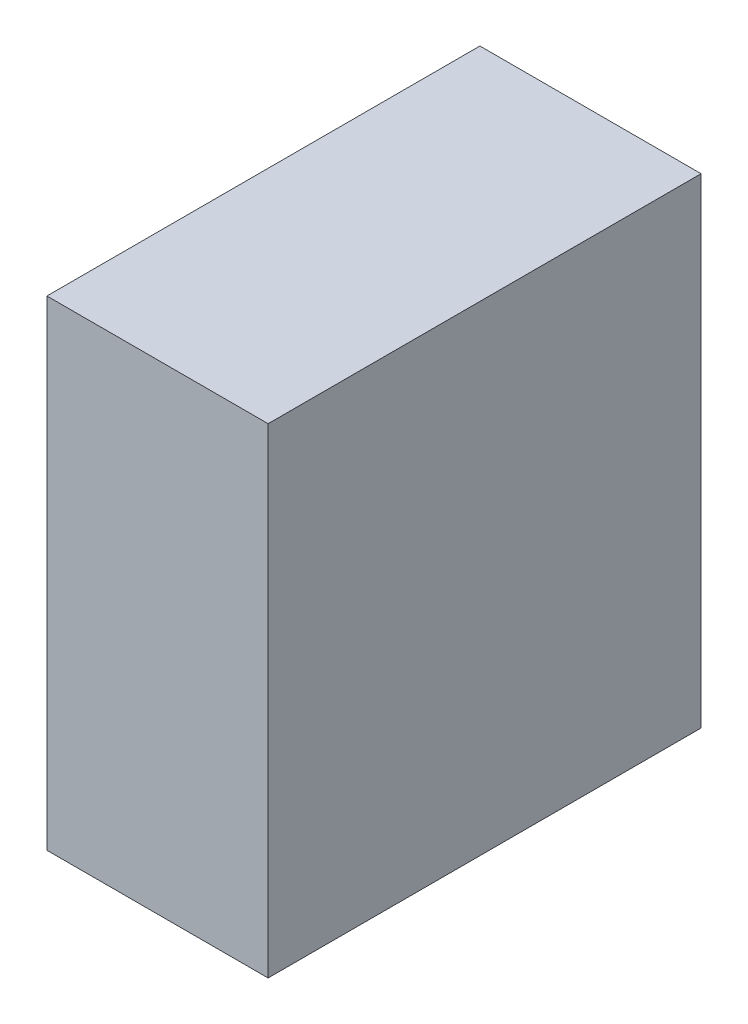
ISO-10303-21;
HEADER;
FILE_DESCRIPTION(('STEP AP214'),'2;1');
FILE_NAME('part.step','',(''),(''),'','','');
FILE_SCHEMA(('AUTOMOTIVE_DESIGN { 1 0 10303 214 1 1 1 1 }'));
ENDSEC;
DATA;
#1=APPLICATION_CONTEXT('core data for automotive mechanical design processes');
#2=APPLICATION_PROTOCOL_DEFINITION('international standard','automotive_design',2000,#1);
#3=PRODUCT_CONTEXT('',#1,'mechanical');
#4=PRODUCT('Part','Part','',(#3));
#5=PRODUCT_RELATED_PRODUCT_CATEGORY('part','',(#4));
#6=PRODUCT_DEFINITION_FORMATION('','',#4);
#7=PRODUCT_DEFINITION_CONTEXT('part definition',#1,'design');
#8=PRODUCT_DEFINITION('design','',#6,#7);
#9=PRODUCT_DEFINITION_SHAPE('','',#8);
#10=(LENGTH_UNIT() NAMED_UNIT(*) SI_UNIT(.MILLI.,.METRE.));
#11=(NAMED_UNIT(*) PLANE_ANGLE_UNIT() SI_UNIT($,.RADIAN.));
#12=(NAMED_UNIT(*) SI_UNIT($,.STERADIAN.) SOLID_ANGLE_UNIT());
#13=UNCERTAINTY_MEASURE_WITH_UNIT(LENGTH_MEASURE(1.E-05),#10,'distance_accuracy_value','');
#14=(GEOMETRIC_REPRESENTATION_CONTEXT(3) GLOBAL_UNCERTAINTY_ASSIGNED_CONTEXT((#13)) GLOBAL_UNIT_ASSIGNED_CONTEXT((#10,
#11,#12)) REPRESENTATION_CONTEXT('',''));
#15=CARTESIAN_POINT('',(0.,0.,0.));
#16=DIRECTION('',(0.,0.,1.));
#17=DIRECTION('',(1.,0.,0.));
#18=AXIS2_PLACEMENT_3D('',#15,#16,#17);
#19=CARTESIAN_POINT('',(2.35000038,-5.09999996,0.));
#20=DIRECTION('',(-1.,0.,0.));
#21=DIRECTION('',(0.,1.,0.));
#22=AXIS2_PLACEMENT_3D('',#19,#20,#21);
#23=PLANE('',#22);
#24=DIRECTION('',(0.,1.,0.));
#25=VECTOR('',#24,1.);
#26=CARTESIAN_POINT('',(2.35000038,-5.09999996,0.));
#27=LINE('',#26,#25);
#28=CARTESIAN_POINT('',(2.35000038,-5.09999996,0.));
#29=VERTEX_POINT('',#28);
#30=CARTESIAN_POINT('',(2.35000038,5.09999996,0.));
#31=VERTEX_POINT('',#30);
#32=EDGE_CURVE('E11',#29,#31,#27,.T.);
#33=ORIENTED_EDGE('',*,*,#32,.T.);
#34=DIRECTION('',(0.,0.,1.));
#35=VECTOR('',#34,1.);
#36=CARTESIAN_POINT('',(2.35000038,5.09999996,0.));
#37=LINE('',#36,#35);
#38=CARTESIAN_POINT('',(2.35000038,5.09999996,9.20000192));
#39=VERTEX_POINT('',#38);
#40=EDGE_CURVE('E24',#31,#39,#37,.T.);
#41=ORIENTED_EDGE('',*,*,#40,.T.);
#42=DIRECTION('',(0.,1.,0.));
#43=VECTOR('',#42,1.);
#44=CARTESIAN_POINT('',(2.35000038,-5.09999996,9.20000192));
#45=LINE('',#44,#43);
#46=CARTESIAN_POINT('',(2.35000038,-5.09999996,9.20000192));
#47=VERTEX_POINT('',#46);
#48=EDGE_CURVE('E87',#47,#39,#45,.T.);
#49=ORIENTED_EDGE('',*,*,#48,.F.);
#50=DIRECTION('',(0.,0.,1.));
#51=VECTOR('',#50,1.);
#52=CARTESIAN_POINT('',(2.35000038,-5.09999996,0.));
#53=LINE('',#52,#51);
#54=EDGE_CURVE('E36',#29,#47,#53,.T.);
#55=ORIENTED_EDGE('',*,*,#54,.F.);
#56=EDGE_LOOP('',(#33,#41,#49,#55));
#57=FACE_BOUND('',#56,.T.);
#58=ADVANCED_FACE('F17',(#57),#23,.F.);
#59=CARTESIAN_POINT('',(2.35000038,5.09999996,0.));
#60=DIRECTION('',(0.,-1.,0.));
#61=DIRECTION('',(-1.,0.,0.));
#62=AXIS2_PLACEMENT_3D('',#59,#60,#61);
#63=PLANE('',#62);
#64=DIRECTION('',(-1.,0.,0.));
#65=VECTOR('',#64,1.);
#66=CARTESIAN_POINT('',(2.35000038,5.09999996,0.));
#67=LINE('',#66,#65);
#68=CARTESIAN_POINT('',(-2.35000038,5.09999996,0.));
#69=VERTEX_POINT('',#68);
#70=EDGE_CURVE('E84',#31,#69,#67,.T.);
#71=ORIENTED_EDGE('',*,*,#70,.T.);
#72=DIRECTION('',(0.,0.,1.));
#73=VECTOR('',#72,1.);
#74=CARTESIAN_POINT('',(-2.35000038,5.09999996,0.));
#75=LINE('',#74,#73);
#76=CARTESIAN_POINT('',(-2.35000038,5.09999996,9.20000192));
#77=VERTEX_POINT('',#76);
#78=EDGE_CURVE('E82',#69,#77,#75,.T.);
#79=ORIENTED_EDGE('',*,*,#78,.T.);
#80=DIRECTION('',(-1.,0.,0.));
#81=VECTOR('',#80,1.);
#82=CARTESIAN_POINT('',(2.35000038,5.09999996,9.20000192));
#83=LINE('',#82,#81);
#84=EDGE_CURVE('E62',#39,#77,#83,.T.);
#85=ORIENTED_EDGE('',*,*,#84,.F.);
#86=ORIENTED_EDGE('',*,*,#40,.F.);
#87=EDGE_LOOP('',(#71,#79,#85,#86));
#88=FACE_BOUND('',#87,.T.);
#89=ADVANCED_FACE('F89',(#88),#63,.F.);
#90=CARTESIAN_POINT('',(-2.35000038,5.09999996,0.));
#91=DIRECTION('',(1.,0.,0.));
#92=DIRECTION('',(0.,-1.,0.));
#93=AXIS2_PLACEMENT_3D('',#90,#91,#92);
#94=PLANE('',#93);
#95=DIRECTION('',(0.,-1.,0.));
#96=VECTOR('',#95,1.);
#97=CARTESIAN_POINT('',(-2.35000038,5.09999996,0.));
#98=LINE('',#97,#96);
#99=CARTESIAN_POINT('',(-2.35000038,-5.09999996,0.));
#100=VERTEX_POINT('',#99);
#101=EDGE_CURVE('E71',#69,#100,#98,.T.);
#102=ORIENTED_EDGE('',*,*,#101,.T.);
#103=DIRECTION('',(0.,0.,1.));
#104=VECTOR('',#103,1.);
#105=CARTESIAN_POINT('',(-2.35000038,-5.09999996,0.));
#106=LINE('',#105,#104);
#107=CARTESIAN_POINT('',(-2.35000038,-5.09999996,9.20000192));
#108=VERTEX_POINT('',#107);
#109=EDGE_CURVE('E65',#100,#108,#106,.T.);
#110=ORIENTED_EDGE('',*,*,#109,.T.);
#111=DIRECTION('',(0.,-1.,0.));
#112=VECTOR('',#111,1.);
#113=CARTESIAN_POINT('',(-2.35000038,5.09999996,9.20000192));
#114=LINE('',#113,#112);
#115=EDGE_CURVE('E57',#77,#108,#114,.T.);
#116=ORIENTED_EDGE('',*,*,#115,.F.);
#117=ORIENTED_EDGE('',*,*,#78,.F.);
#118=EDGE_LOOP('',(#102,#110,#116,#117));
#119=FACE_BOUND('',#118,.T.);
#120=ADVANCED_FACE('F69',(#119),#94,.F.);
#121=CARTESIAN_POINT('',(-2.35000038,-5.09999996,0.));
#122=DIRECTION('',(0.,1.,0.));
#123=DIRECTION('',(1.,0.,0.));
#124=AXIS2_PLACEMENT_3D('',#121,#122,#123);
#125=PLANE('',#124);
#126=DIRECTION('',(1.,0.,0.));
#127=VECTOR('',#126,1.);
#128=CARTESIAN_POINT('',(-2.35000038,-5.09999996,0.));
#129=LINE('',#128,#127);
#130=EDGE_CURVE('E66',#100,#29,#129,.T.);
#131=ORIENTED_EDGE('',*,*,#130,.T.);
#132=ORIENTED_EDGE('',*,*,#54,.T.);
#133=DIRECTION('',(1.,0.,0.));
#134=VECTOR('',#133,1.);
#135=CARTESIAN_POINT('',(-2.35000038,-5.09999996,9.20000192));
#136=LINE('',#135,#134);
#137=EDGE_CURVE('E61',#108,#47,#136,.T.);
#138=ORIENTED_EDGE('',*,*,#137,.F.);
#139=ORIENTED_EDGE('',*,*,#109,.F.);
#140=EDGE_LOOP('',(#131,#132,#138,#139));
#141=FACE_BOUND('',#140,.T.);
#142=ADVANCED_FACE('F76',(#141),#125,.F.);
#143=CARTESIAN_POINT('',(0.,0.,0.));
#144=DIRECTION('',(0.,0.,1.));
#145=DIRECTION('',(1.,0.,0.));
#146=AXIS2_PLACEMENT_3D('',#143,#144,#145);
#147=PLANE('',#146);
#148=ORIENTED_EDGE('',*,*,#130,.F.);
#149=ORIENTED_EDGE('',*,*,#101,.F.);
#150=ORIENTED_EDGE('',*,*,#70,.F.);
#151=ORIENTED_EDGE('',*,*,#32,.F.);
#152=EDGE_LOOP('',(#148,#149,#150,#151));
#153=FACE_BOUND('',#152,.T.);
#154=ADVANCED_FACE('F91',(#153),#147,.F.);
#155=CARTESIAN_POINT('',(0.,0.,9.20000192));
#156=DIRECTION('',(0.,0.,1.));
#157=DIRECTION('',(1.,0.,0.));
#158=AXIS2_PLACEMENT_3D('',#155,#156,#157);
#159=PLANE('',#158);
#160=ORIENTED_EDGE('',*,*,#48,.T.);
#161=ORIENTED_EDGE('',*,*,#84,.T.);
#162=ORIENTED_EDGE('',*,*,#115,.T.);
#163=ORIENTED_EDGE('',*,*,#137,.T.);
#164=EDGE_LOOP('',(#160,#161,#162,#163));
#165=FACE_BOUND('',#164,.T.);
#166=ADVANCED_FACE('F59',(#165),#159,.T.);
#167=CLOSED_SHELL('',(#58,#89,#120,#142,#154,#166));
#168=MANIFOLD_SOLID_BREP('B1',#167);
#169=ADVANCED_BREP_SHAPE_REPRESENTATION('',(#18,#168),#14);
#170=SHAPE_DEFINITION_REPRESENTATION(#9,#169);
ENDSEC;
END-ISO-10303-21;
